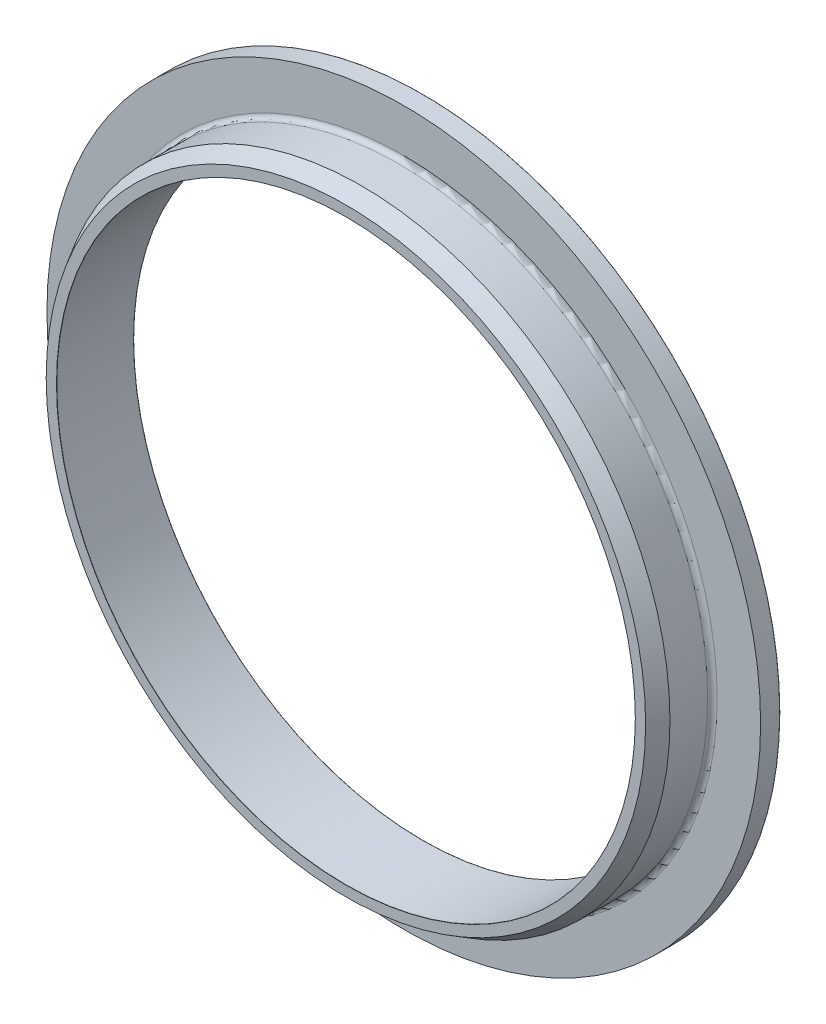
ISO-10303-21;
HEADER;
FILE_DESCRIPTION(('STEP AP214'),'2;1');
FILE_NAME('part.step','',(''),(''),'','','');
FILE_SCHEMA(('AUTOMOTIVE_DESIGN { 1 0 10303 214 1 1 1 1 }'));
ENDSEC;
DATA;
#1=APPLICATION_CONTEXT('core data for automotive mechanical design processes');
#2=APPLICATION_PROTOCOL_DEFINITION('international standard','automotive_design',2000,#1);
#3=PRODUCT_CONTEXT('',#1,'mechanical');
#4=PRODUCT('Part','Part','',(#3));
#5=PRODUCT_RELATED_PRODUCT_CATEGORY('part','',(#4));
#6=PRODUCT_DEFINITION_FORMATION('','',#4);
#7=PRODUCT_DEFINITION_CONTEXT('part definition',#1,'design');
#8=PRODUCT_DEFINITION('design','',#6,#7);
#9=PRODUCT_DEFINITION_SHAPE('','',#8);
#10=(LENGTH_UNIT() NAMED_UNIT(*) SI_UNIT(.MILLI.,.METRE.));
#11=(NAMED_UNIT(*) PLANE_ANGLE_UNIT() SI_UNIT($,.RADIAN.));
#12=(NAMED_UNIT(*) SI_UNIT($,.STERADIAN.) SOLID_ANGLE_UNIT());
#13=UNCERTAINTY_MEASURE_WITH_UNIT(LENGTH_MEASURE(1.E-05),#10,'distance_accuracy_value','');
#14=(GEOMETRIC_REPRESENTATION_CONTEXT(3) GLOBAL_UNCERTAINTY_ASSIGNED_CONTEXT((#13)) GLOBAL_UNIT_ASSIGNED_CONTEXT((#10,
#11,#12)) REPRESENTATION_CONTEXT('',''));
#15=CARTESIAN_POINT('',(0.,0.,0.));
#16=DIRECTION('',(0.,0.,1.));
#17=DIRECTION('',(1.,0.,0.));
#18=AXIS2_PLACEMENT_3D('',#15,#16,#17);
#19=CARTESIAN_POINT('',(0.,0.,3.2));
#20=DIRECTION('',(0.,0.,-1.));
#21=DIRECTION('',(1.,0.,0.));
#22=AXIS2_PLACEMENT_3D('',#19,#20,#21);
#23=CONICAL_SURFACE('',#22,16.,0.523598775598);
#24=DIRECTION('',(-0.50000000000019,0.,0.866025403784329));
#25=VECTOR('',#24,1.);
#26=CARTESIAN_POINT('',(16.,0.,3.2));
#27=LINE('',#26,#25);
#28=CARTESIAN_POINT('',(16.,0.,3.2));
#29=VERTEX_POINT('',#28);
#30=CARTESIAN_POINT('',(15.538119784648,0.,4.));
#31=VERTEX_POINT('',#30);
#32=EDGE_CURVE('E11',#29,#31,#27,.T.);
#33=ORIENTED_EDGE('',*,*,#32,.F.);
#34=CARTESIAN_POINT('',(0.,0.,3.2));
#35=DIRECTION('',(0.,0.,1.));
#36=DIRECTION('',(1.,0.,0.));
#37=AXIS2_PLACEMENT_3D('',#34,#35,#36);
#38=CIRCLE('',#37,16.);
#39=EDGE_CURVE('E138',#29,#29,#38,.T.);
#40=ORIENTED_EDGE('',*,*,#39,.T.);
#41=ORIENTED_EDGE('',*,*,#32,.T.);
#42=CARTESIAN_POINT('',(0.,0.,4.));
#43=DIRECTION('',(0.,0.,1.));
#44=DIRECTION('',(1.,0.,0.));
#45=AXIS2_PLACEMENT_3D('',#42,#43,#44);
#46=CIRCLE('',#45,15.538119784648);
#47=EDGE_CURVE('E117',#31,#31,#46,.T.);
#48=ORIENTED_EDGE('',*,*,#47,.F.);
#49=EDGE_LOOP('',(#33,#40,#41,#48));
#50=FACE_BOUND('',#49,.T.);
#51=ADVANCED_FACE('F17',(#50),#23,.T.);
#52=CARTESIAN_POINT('',(0.,0.,0.));
#53=DIRECTION('',(0.,0.,-1.));
#54=DIRECTION('',(1.,0.,0.));
#55=AXIS2_PLACEMENT_3D('',#52,#53,#54);
#56=CYLINDRICAL_SURFACE('',#55,16.);
#57=ORIENTED_EDGE('',*,*,#39,.F.);
#58=DIRECTION('',(0.,0.,1.));
#59=VECTOR('',#58,1.);
#60=CARTESIAN_POINT('',(16.,0.,0.));
#61=LINE('',#60,#59);
#62=CARTESIAN_POINT('',(16.,0.,1.2499));
#63=VERTEX_POINT('',#62);
#64=EDGE_CURVE('E25',#63,#29,#61,.T.);
#65=ORIENTED_EDGE('',*,*,#64,.F.);
#66=CARTESIAN_POINT('',(0.,0.,1.2499));
#67=DIRECTION('',(0.,0.,-1.));
#68=DIRECTION('',(1.,0.,0.));
#69=AXIS2_PLACEMENT_3D('',#66,#67,#68);
#70=CIRCLE('',#69,16.);
#71=EDGE_CURVE('E113',#63,#63,#70,.T.);
#72=ORIENTED_EDGE('',*,*,#71,.F.);
#73=ORIENTED_EDGE('',*,*,#64,.T.);
#74=EDGE_LOOP('',(#57,#65,#72,#73));
#75=FACE_BOUND('',#74,.T.);
#76=ADVANCED_FACE('F147',(#75),#56,.T.);
#77=CARTESIAN_POINT('',(0.,0.,4.));
#78=DIRECTION('',(0.,0.,1.));
#79=DIRECTION('',(1.,0.,0.));
#80=AXIS2_PLACEMENT_3D('',#77,#78,#79);
#81=PLANE('',#80);
#82=ORIENTED_EDGE('',*,*,#47,.T.);
#83=EDGE_LOOP('',(#82));
#84=FACE_BOUND('',#83,.T.);
#85=CARTESIAN_POINT('',(0.,0.,4.));
#86=DIRECTION('',(0.,0.,1.));
#87=DIRECTION('',(1.,0.,0.));
#88=AXIS2_PLACEMENT_3D('',#85,#86,#87);
#89=CIRCLE('',#88,15.004663076582);
#90=CARTESIAN_POINT('',(15.004663076582,0.,4.));
#91=VERTEX_POINT('',#90);
#92=EDGE_CURVE('E103',#91,#91,#89,.T.);
#93=ORIENTED_EDGE('',*,*,#92,.F.);
#94=EDGE_LOOP('',(#93));
#95=FACE_BOUND('',#94,.T.);
#96=ADVANCED_FACE('F154',(#84,#95),#81,.T.);
#97=CARTESIAN_POINT('',(0.,0.,1.2499));
#98=DIRECTION('',(0.,0.,1.));
#99=DIRECTION('',(1.,0.,0.));
#100=AXIS2_PLACEMENT_3D('',#97,#98,#99);
#101=TOROIDAL_SURFACE('',#100,16.2499,0.2499);
#102=CARTESIAN_POINT('',(16.2499,0.,1.2499));
#103=DIRECTION('',(0.,-1.,0.));
#104=DIRECTION('',(1.,0.,0.));
#105=AXIS2_PLACEMENT_3D('',#102,#103,#104);
#106=CIRCLE('',#105,0.2499);
#107=CARTESIAN_POINT('',(16.2499,0.,1.));
#108=VERTEX_POINT('',#107);
#109=EDGE_CURVE('E118',#63,#108,#106,.T.);
#110=ORIENTED_EDGE('',*,*,#109,.F.);
#111=ORIENTED_EDGE('',*,*,#71,.T.);
#112=ORIENTED_EDGE('',*,*,#109,.T.);
#113=CARTESIAN_POINT('',(0.,0.,1.));
#114=DIRECTION('',(0.,0.,-1.));
#115=DIRECTION('',(1.,0.,0.));
#116=AXIS2_PLACEMENT_3D('',#113,#114,#115);
#117=CIRCLE('',#116,16.2499);
#118=EDGE_CURVE('E100',#108,#108,#117,.T.);
#119=ORIENTED_EDGE('',*,*,#118,.F.);
#120=EDGE_LOOP('',(#110,#111,#112,#119));
#121=FACE_BOUND('',#120,.T.);
#122=ADVANCED_FACE('F158',(#121),#101,.F.);
#123=CARTESIAN_POINT('',(0.,0.,3.99));
#124=DIRECTION('',(0.,0.,1.));
#125=DIRECTION('',(1.,0.,0.));
#126=AXIS2_PLACEMENT_3D('',#123,#124,#125);
#127=CONICAL_SURFACE('',#126,15.,0.436332312999);
#128=ORIENTED_EDGE('',*,*,#92,.T.);
#129=DIRECTION('',(0.422618261740812,0.,0.906307787036597));
#130=VECTOR('',#129,1.);
#131=CARTESIAN_POINT('',(15.,0.,3.99));
#132=LINE('',#131,#130);
#133=CARTESIAN_POINT('',(15.,0.,3.99));
#134=VERTEX_POINT('',#133);
#135=EDGE_CURVE('E126',#134,#91,#132,.T.);
#136=ORIENTED_EDGE('',*,*,#135,.F.);
#137=CARTESIAN_POINT('',(0.,0.,3.99));
#138=DIRECTION('',(0.,0.,1.));
#139=DIRECTION('',(1.,0.,0.));
#140=AXIS2_PLACEMENT_3D('',#137,#138,#139);
#141=CIRCLE('',#140,15.);
#142=EDGE_CURVE('E104',#134,#134,#141,.T.);
#143=ORIENTED_EDGE('',*,*,#142,.F.);
#144=ORIENTED_EDGE('',*,*,#135,.T.);
#145=EDGE_LOOP('',(#128,#136,#143,#144));
#146=FACE_BOUND('',#145,.T.);
#147=ADVANCED_FACE('F169',(#146),#127,.F.);
#148=CARTESIAN_POINT('',(0.,0.,1.));
#149=DIRECTION('',(0.,0.,1.));
#150=DIRECTION('',(1.,0.,0.));
#151=AXIS2_PLACEMENT_3D('',#148,#149,#150);
#152=PLANE('',#151);
#153=CARTESIAN_POINT('',(0.,0.,1.));
#154=DIRECTION('',(0.,0.,1.));
#155=DIRECTION('',(1.,0.,0.));
#156=AXIS2_PLACEMENT_3D('',#153,#154,#155);
#157=CIRCLE('',#156,18.5);
#158=CARTESIAN_POINT('',(18.5,0.,1.));
#159=VERTEX_POINT('',#158);
#160=EDGE_CURVE('E121',#159,#159,#157,.T.);
#161=ORIENTED_EDGE('',*,*,#160,.T.);
#162=EDGE_LOOP('',(#161));
#163=FACE_BOUND('',#162,.T.);
#164=ORIENTED_EDGE('',*,*,#118,.T.);
#165=EDGE_LOOP('',(#164));
#166=FACE_BOUND('',#165,.T.);
#167=ADVANCED_FACE('F166',(#163,#166),#152,.T.);
#168=CARTESIAN_POINT('',(0.,0.,0.));
#169=DIRECTION('',(0.,0.,-1.));
#170=DIRECTION('',(1.,0.,0.));
#171=AXIS2_PLACEMENT_3D('',#168,#169,#170);
#172=CYLINDRICAL_SURFACE('',#171,15.);
#173=DIRECTION('',(0.,0.,1.));
#174=VECTOR('',#173,1.);
#175=CARTESIAN_POINT('',(15.,0.,0.));
#176=LINE('',#175,#174);
#177=CARTESIAN_POINT('',(15.,0.,0.01));
#178=VERTEX_POINT('',#177);
#179=EDGE_CURVE('E124',#178,#134,#176,.T.);
#180=ORIENTED_EDGE('',*,*,#179,.T.);
#181=ORIENTED_EDGE('',*,*,#142,.T.);
#182=ORIENTED_EDGE('',*,*,#179,.F.);
#183=CARTESIAN_POINT('',(0.,0.,0.01));
#184=DIRECTION('',(0.,0.,1.));
#185=DIRECTION('',(1.,0.,0.));
#186=AXIS2_PLACEMENT_3D('',#183,#184,#185);
#187=CIRCLE('',#186,15.);
#188=EDGE_CURVE('E108',#178,#178,#187,.T.);
#189=ORIENTED_EDGE('',*,*,#188,.F.);
#190=EDGE_LOOP('',(#180,#181,#182,#189));
#191=FACE_BOUND('',#190,.T.);
#192=ADVANCED_FACE('F162',(#191),#172,.F.);
#193=CARTESIAN_POINT('',(0.,0.,0.));
#194=DIRECTION('',(0.,0.,-1.));
#195=DIRECTION('',(1.,0.,0.));
#196=AXIS2_PLACEMENT_3D('',#193,#194,#195);
#197=CYLINDRICAL_SURFACE('',#196,18.5);
#198=CARTESIAN_POINT('',(0.,0.,0.01));
#199=DIRECTION('',(0.,0.,1.));
#200=DIRECTION('',(1.,0.,0.));
#201=AXIS2_PLACEMENT_3D('',#198,#199,#200);
#202=CIRCLE('',#201,18.5);
#203=CARTESIAN_POINT('',(18.5,0.,0.01));
#204=VERTEX_POINT('',#203);
#205=EDGE_CURVE('E84',#204,#204,#202,.T.);
#206=ORIENTED_EDGE('',*,*,#205,.T.);
#207=DIRECTION('',(0.,0.,1.));
#208=VECTOR('',#207,1.);
#209=CARTESIAN_POINT('',(18.5,0.,0.));
#210=LINE('',#209,#208);
#211=EDGE_CURVE('E112',#204,#159,#210,.T.);
#212=ORIENTED_EDGE('',*,*,#211,.T.);
#213=ORIENTED_EDGE('',*,*,#160,.F.);
#214=ORIENTED_EDGE('',*,*,#211,.F.);
#215=EDGE_LOOP('',(#206,#212,#213,#214));
#216=FACE_BOUND('',#215,.T.);
#217=ADVANCED_FACE('F165',(#216),#197,.T.);
#218=CARTESIAN_POINT('',(0.,0.,0.01));
#219=DIRECTION('',(0.,0.,-1.));
#220=DIRECTION('',(1.,0.,0.));
#221=AXIS2_PLACEMENT_3D('',#218,#219,#220);
#222=CONICAL_SURFACE('',#221,15.,0.436332312999);
#223=DIRECTION('',(0.422618261740812,0.,-0.906307787036597));
#224=VECTOR('',#223,1.);
#225=CARTESIAN_POINT('',(15.,0.,0.01));
#226=LINE('',#225,#224);
#227=CARTESIAN_POINT('',(15.004663076582,0.,0.));
#228=VERTEX_POINT('',#227);
#229=EDGE_CURVE('E93',#178,#228,#226,.T.);
#230=ORIENTED_EDGE('',*,*,#229,.F.);
#231=ORIENTED_EDGE('',*,*,#188,.T.);
#232=ORIENTED_EDGE('',*,*,#229,.T.);
#233=CARTESIAN_POINT('',(0.,0.,0.));
#234=DIRECTION('',(0.,0.,1.));
#235=DIRECTION('',(1.,0.,0.));
#236=AXIS2_PLACEMENT_3D('',#233,#234,#235);
#237=CIRCLE('',#236,15.004663076582);
#238=EDGE_CURVE('E86',#228,#228,#237,.T.);
#239=ORIENTED_EDGE('',*,*,#238,.F.);
#240=EDGE_LOOP('',(#230,#231,#232,#239));
#241=FACE_BOUND('',#240,.T.);
#242=ADVANCED_FACE('F172',(#241),#222,.F.);
#243=CARTESIAN_POINT('',(0.,0.,0.01));
#244=DIRECTION('',(0.,0.,1.));
#245=DIRECTION('',(1.,0.,0.));
#246=AXIS2_PLACEMENT_3D('',#243,#244,#245);
#247=CONICAL_SURFACE('',#246,18.5,0.436332312999);
#248=CARTESIAN_POINT('',(0.,0.,0.));
#249=DIRECTION('',(0.,0.,1.));
#250=DIRECTION('',(1.,0.,0.));
#251=AXIS2_PLACEMENT_3D('',#248,#249,#250);
#252=CIRCLE('',#251,18.495336923418);
#253=CARTESIAN_POINT('',(18.495336923418,0.,0.));
#254=VERTEX_POINT('',#253);
#255=EDGE_CURVE('E82',#254,#254,#252,.T.);
#256=ORIENTED_EDGE('',*,*,#255,.T.);
#257=DIRECTION('',(-0.422618261740812,0.,-0.906307787036597));
#258=VECTOR('',#257,1.);
#259=CARTESIAN_POINT('',(18.5,0.,0.01));
#260=LINE('',#259,#258);
#261=EDGE_CURVE('E79',#204,#254,#260,.T.);
#262=ORIENTED_EDGE('',*,*,#261,.F.);
#263=ORIENTED_EDGE('',*,*,#205,.F.);
#264=ORIENTED_EDGE('',*,*,#261,.T.);
#265=EDGE_LOOP('',(#256,#262,#263,#264));
#266=FACE_BOUND('',#265,.T.);
#267=ADVANCED_FACE('F80',(#266),#247,.T.);
#268=CARTESIAN_POINT('',(0.,0.,0.));
#269=DIRECTION('',(0.,0.,1.));
#270=DIRECTION('',(1.,0.,0.));
#271=AXIS2_PLACEMENT_3D('',#268,#269,#270);
#272=PLANE('',#271);
#273=ORIENTED_EDGE('',*,*,#238,.T.);
#274=EDGE_LOOP('',(#273));
#275=FACE_BOUND('',#274,.T.);
#276=ORIENTED_EDGE('',*,*,#255,.F.);
#277=EDGE_LOOP('',(#276));
#278=FACE_BOUND('',#277,.T.);
#279=ADVANCED_FACE('F179',(#275,#278),#272,.F.);
#280=CLOSED_SHELL('',(#51,#76,#96,#122,#147,#167,#192,#217,#242,#267,#279));
#281=MANIFOLD_SOLID_BREP('B1',#280);
#282=ADVANCED_BREP_SHAPE_REPRESENTATION('',(#18,#281),#14);
#283=SHAPE_DEFINITION_REPRESENTATION(#9,#282);
ENDSEC;
END-ISO-10303-21;
